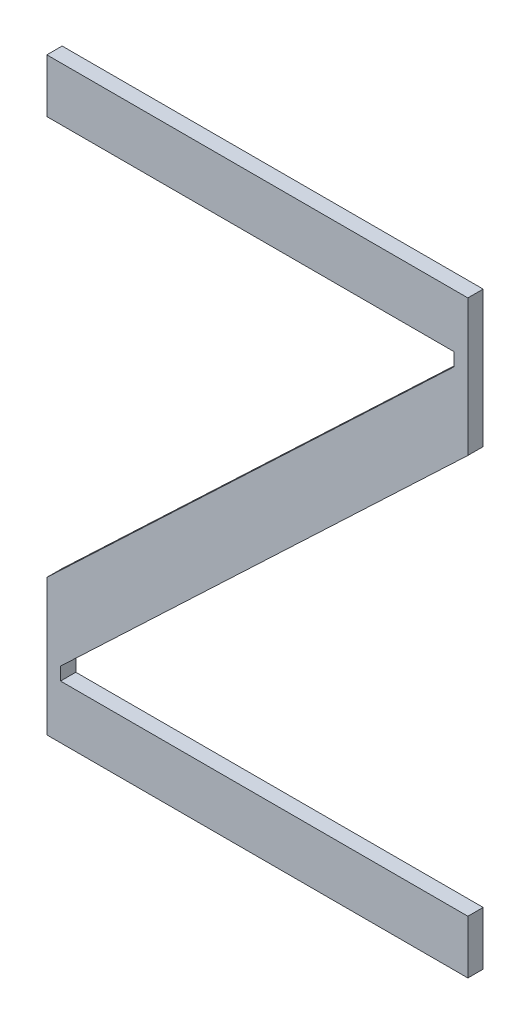
ISO-10303-21;
HEADER;
FILE_DESCRIPTION(('STEP AP214'),'2;1');
FILE_NAME('part.step','',(''),(''),'','','');
FILE_SCHEMA(('AUTOMOTIVE_DESIGN { 1 0 10303 214 1 1 1 1 }'));
ENDSEC;
DATA;
#1=APPLICATION_CONTEXT('core data for automotive mechanical design processes');
#2=APPLICATION_PROTOCOL_DEFINITION('international standard','automotive_design',2000,#1);
#3=PRODUCT_CONTEXT('',#1,'mechanical');
#4=PRODUCT('Part','Part','',(#3));
#5=PRODUCT_RELATED_PRODUCT_CATEGORY('part','',(#4));
#6=PRODUCT_DEFINITION_FORMATION('','',#4);
#7=PRODUCT_DEFINITION_CONTEXT('part definition',#1,'design');
#8=PRODUCT_DEFINITION('design','',#6,#7);
#9=PRODUCT_DEFINITION_SHAPE('','',#8);
#10=(LENGTH_UNIT() NAMED_UNIT(*) SI_UNIT(.MILLI.,.METRE.));
#11=(NAMED_UNIT(*) PLANE_ANGLE_UNIT() SI_UNIT($,.RADIAN.));
#12=(NAMED_UNIT(*) SI_UNIT($,.STERADIAN.) SOLID_ANGLE_UNIT());
#13=UNCERTAINTY_MEASURE_WITH_UNIT(LENGTH_MEASURE(1.E-05),#10,'distance_accuracy_value','');
#14=(GEOMETRIC_REPRESENTATION_CONTEXT(3) GLOBAL_UNCERTAINTY_ASSIGNED_CONTEXT((#13)) GLOBAL_UNIT_ASSIGNED_CONTEXT((#10,
#11,#12)) REPRESENTATION_CONTEXT('',''));
#15=CARTESIAN_POINT('',(0.,0.,0.));
#16=DIRECTION('',(0.,0.,1.));
#17=DIRECTION('',(1.,0.,0.));
#18=AXIS2_PLACEMENT_3D('',#15,#16,#17);
#19=CARTESIAN_POINT('',(0.,0.,20.));
#20=DIRECTION('',(0.,-1.,0.));
#21=DIRECTION('',(1.,0.,0.));
#22=AXIS2_PLACEMENT_3D('',#19,#20,#21);
#23=PLANE('',#22);
#24=DIRECTION('',(-1.,0.,0.));
#25=VECTOR('',#24,1.);
#26=CARTESIAN_POINT('',(0.,0.,0.));
#27=LINE('',#26,#25);
#28=CARTESIAN_POINT('',(0.,0.,0.));
#29=VERTEX_POINT('',#28);
#30=CARTESIAN_POINT('',(-551.,0.,0.));
#31=VERTEX_POINT('',#30);
#32=EDGE_CURVE('E156',#29,#31,#27,.T.);
#33=ORIENTED_EDGE('',*,*,#32,.T.);
#34=DIRECTION('',(0.,0.,-1.));
#35=VECTOR('',#34,1.);
#36=CARTESIAN_POINT('',(-551.,0.,20.));
#37=LINE('',#36,#35);
#38=CARTESIAN_POINT('',(-551.,0.,20.));
#39=VERTEX_POINT('',#38);
#40=EDGE_CURVE('E40',#39,#31,#37,.T.);
#41=ORIENTED_EDGE('',*,*,#40,.F.);
#42=DIRECTION('',(-1.,0.,0.));
#43=VECTOR('',#42,1.);
#44=CARTESIAN_POINT('',(0.,0.,20.));
#45=LINE('',#44,#43);
#46=CARTESIAN_POINT('',(0.,0.,20.));
#47=VERTEX_POINT('',#46);
#48=EDGE_CURVE('E104',#47,#39,#45,.T.);
#49=ORIENTED_EDGE('',*,*,#48,.F.);
#50=DIRECTION('',(0.,0.,-1.));
#51=VECTOR('',#50,1.);
#52=CARTESIAN_POINT('',(0.,0.,20.));
#53=LINE('',#52,#51);
#54=EDGE_CURVE('E11',#47,#29,#53,.T.);
#55=ORIENTED_EDGE('',*,*,#54,.T.);
#56=EDGE_LOOP('',(#33,#41,#49,#55));
#57=FACE_BOUND('',#56,.T.);
#58=ADVANCED_FACE('F32',(#57),#23,.F.);
#59=CARTESIAN_POINT('',(-551.,0.,20.));
#60=DIRECTION('',(1.,0.,0.));
#61=DIRECTION('',(0.,0.,-1.));
#62=AXIS2_PLACEMENT_3D('',#59,#60,#61);
#63=PLANE('',#62);
#64=DIRECTION('',(0.,-1.,0.));
#65=VECTOR('',#64,1.);
#66=CARTESIAN_POINT('',(-551.,0.,0.));
#67=LINE('',#66,#65);
#68=CARTESIAN_POINT('',(-551.,-70.0000000000001,0.));
#69=VERTEX_POINT('',#68);
#70=EDGE_CURVE('E158',#31,#69,#67,.T.);
#71=ORIENTED_EDGE('',*,*,#70,.T.);
#72=DIRECTION('',(0.,0.,-1.));
#73=VECTOR('',#72,1.);
#74=CARTESIAN_POINT('',(-551.,-70.0000000000001,20.));
#75=LINE('',#74,#73);
#76=CARTESIAN_POINT('',(-551.,-70.0000000000001,20.));
#77=VERTEX_POINT('',#76);
#78=EDGE_CURVE('E196',#77,#69,#75,.T.);
#79=ORIENTED_EDGE('',*,*,#78,.F.);
#80=DIRECTION('',(0.,-1.,0.));
#81=VECTOR('',#80,1.);
#82=CARTESIAN_POINT('',(-551.,0.,20.));
#83=LINE('',#82,#81);
#84=EDGE_CURVE('E204',#39,#77,#83,.T.);
#85=ORIENTED_EDGE('',*,*,#84,.F.);
#86=ORIENTED_EDGE('',*,*,#40,.T.);
#87=EDGE_LOOP('',(#71,#79,#85,#86));
#88=FACE_BOUND('',#87,.T.);
#89=ADVANCED_FACE('F202',(#88),#63,.F.);
#90=CARTESIAN_POINT('',(-18.2882568755574,-70.,20.));
#91=DIRECTION('',(0.,1.,0.));
#92=DIRECTION('',(-1.,0.,0.));
#93=AXIS2_PLACEMENT_3D('',#90,#91,#92);
#94=PLANE('',#93);
#95=DIRECTION('',(1.,0.,0.));
#96=VECTOR('',#95,1.);
#97=CARTESIAN_POINT('',(-18.2882568755574,-70.,0.));
#98=LINE('',#97,#96);
#99=CARTESIAN_POINT('',(-18.2882568755574,-70.,0.));
#100=VERTEX_POINT('',#99);
#101=EDGE_CURVE('E160',#69,#100,#98,.T.);
#102=ORIENTED_EDGE('',*,*,#101,.T.);
#103=DIRECTION('',(0.,0.,-1.));
#104=VECTOR('',#103,1.);
#105=CARTESIAN_POINT('',(-18.2882568755574,-70.,20.));
#106=LINE('',#105,#104);
#107=CARTESIAN_POINT('',(-18.2882568755574,-70.,20.));
#108=VERTEX_POINT('',#107);
#109=EDGE_CURVE('E193',#108,#100,#106,.T.);
#110=ORIENTED_EDGE('',*,*,#109,.F.);
#111=DIRECTION('',(1.,0.,0.));
#112=VECTOR('',#111,1.);
#113=CARTESIAN_POINT('',(-18.2882568755574,-70.,20.));
#114=LINE('',#113,#112);
#115=EDGE_CURVE('E223',#77,#108,#114,.T.);
#116=ORIENTED_EDGE('',*,*,#115,.F.);
#117=ORIENTED_EDGE('',*,*,#78,.T.);
#118=EDGE_LOOP('',(#102,#110,#116,#117));
#119=FACE_BOUND('',#118,.T.);
#120=ADVANCED_FACE('F214',(#119),#94,.F.);
#121=CARTESIAN_POINT('',(-18.2882568755574,-70.,20.));
#122=DIRECTION('',(1.,0.,0.));
#123=DIRECTION('',(0.,1.,0.));
#124=AXIS2_PLACEMENT_3D('',#121,#122,#123);
#125=PLANE('',#124);
#126=DIRECTION('',(0.,-1.,0.));
#127=VECTOR('',#126,1.);
#128=CARTESIAN_POINT('',(-18.2882568755574,-70.,0.));
#129=LINE('',#128,#127);
#130=CARTESIAN_POINT('',(-18.2882568755573,-87.3325290711585,0.));
#131=VERTEX_POINT('',#130);
#132=EDGE_CURVE('E162',#100,#131,#129,.T.);
#133=ORIENTED_EDGE('',*,*,#132,.T.);
#134=DIRECTION('',(0.,0.,-1.));
#135=VECTOR('',#134,1.);
#136=CARTESIAN_POINT('',(-18.2882568755573,-87.3325290711585,20.));
#137=LINE('',#136,#135);
#138=CARTESIAN_POINT('',(-18.2882568755573,-87.3325290711585,20.));
#139=VERTEX_POINT('',#138);
#140=EDGE_CURVE('E190',#139,#131,#137,.T.);
#141=ORIENTED_EDGE('',*,*,#140,.F.);
#142=DIRECTION('',(0.,-1.,0.));
#143=VECTOR('',#142,1.);
#144=CARTESIAN_POINT('',(-18.2882568755574,-70.,20.));
#145=LINE('',#144,#143);
#146=EDGE_CURVE('E220',#108,#139,#145,.T.);
#147=ORIENTED_EDGE('',*,*,#146,.F.);
#148=ORIENTED_EDGE('',*,*,#109,.T.);
#149=EDGE_LOOP('',(#133,#141,#147,#148));
#150=FACE_BOUND('',#149,.T.);
#151=ADVANCED_FACE('F218',(#150),#125,.F.);
#152=CARTESIAN_POINT('',(-18.2882568755573,-87.3325290711585,20.));
#153=DIRECTION('',(0.687887112888709,-0.725817690554341,0.));
#154=DIRECTION('',(0.725817690554341,0.687887112888709,0.));
#155=AXIS2_PLACEMENT_3D('',#152,#153,#154);
#156=PLANE('',#155);
#157=DIRECTION('',(-0.725817690554341,-0.687887112888709,0.));
#158=VECTOR('',#157,1.);
#159=CARTESIAN_POINT('',(-18.2882568755573,-87.3325290711585,0.));
#160=LINE('',#159,#158);
#161=CARTESIAN_POINT('',(-551.,-592.205237119804,0.));
#162=VERTEX_POINT('',#161);
#163=EDGE_CURVE('E164',#131,#162,#160,.T.);
#164=ORIENTED_EDGE('',*,*,#163,.T.);
#165=DIRECTION('',(0.,0.,-1.));
#166=VECTOR('',#165,1.);
#167=CARTESIAN_POINT('',(-551.,-592.205237119804,20.));
#168=LINE('',#167,#166);
#169=CARTESIAN_POINT('',(-551.,-592.205237119804,20.));
#170=VERTEX_POINT('',#169);
#171=EDGE_CURVE('E187',#170,#162,#168,.T.);
#172=ORIENTED_EDGE('',*,*,#171,.F.);
#173=DIRECTION('',(-0.725817690554341,-0.687887112888709,0.));
#174=VECTOR('',#173,1.);
#175=CARTESIAN_POINT('',(-18.2882568755573,-87.3325290711585,20.));
#176=LINE('',#175,#174);
#177=EDGE_CURVE('E222',#139,#170,#176,.T.);
#178=ORIENTED_EDGE('',*,*,#177,.F.);
#179=ORIENTED_EDGE('',*,*,#140,.T.);
#180=EDGE_LOOP('',(#164,#172,#178,#179));
#181=FACE_BOUND('',#180,.T.);
#182=ADVANCED_FACE('F265',(#181),#156,.F.);
#183=CARTESIAN_POINT('',(-551.,-700.8,20.));
#184=DIRECTION('',(1.,0.,0.));
#185=DIRECTION('',(0.,0.,-1.));
#186=AXIS2_PLACEMENT_3D('',#183,#184,#185);
#187=PLANE('',#186);
#188=DIRECTION('',(0.,-1.,0.));
#189=VECTOR('',#188,1.);
#190=CARTESIAN_POINT('',(-551.,-700.8,0.));
#191=LINE('',#190,#189);
#192=CARTESIAN_POINT('',(-551.,-770.8,0.));
#193=VERTEX_POINT('',#192);
#194=EDGE_CURVE('E167',#162,#193,#191,.T.);
#195=ORIENTED_EDGE('',*,*,#194,.T.);
#196=DIRECTION('',(0.,0.,-1.));
#197=VECTOR('',#196,1.);
#198=CARTESIAN_POINT('',(-551.,-770.8,20.));
#199=LINE('',#198,#197);
#200=CARTESIAN_POINT('',(-551.,-770.8,20.));
#201=VERTEX_POINT('',#200);
#202=EDGE_CURVE('E184',#201,#193,#199,.T.);
#203=ORIENTED_EDGE('',*,*,#202,.F.);
#204=DIRECTION('',(0.,-1.,0.));
#205=VECTOR('',#204,1.);
#206=CARTESIAN_POINT('',(-551.,-592.205237119804,20.));
#207=LINE('',#206,#205);
#208=EDGE_CURVE('E225',#170,#201,#207,.T.);
#209=ORIENTED_EDGE('',*,*,#208,.F.);
#210=ORIENTED_EDGE('',*,*,#171,.T.);
#211=EDGE_LOOP('',(#195,#203,#209,#210));
#212=FACE_BOUND('',#211,.T.);
#213=ADVANCED_FACE('F268',(#212),#187,.F.);
#214=CARTESIAN_POINT('',(-551.,-770.8,20.));
#215=DIRECTION('',(0.,1.,0.));
#216=DIRECTION('',(0.,0.,1.));
#217=AXIS2_PLACEMENT_3D('',#214,#215,#216);
#218=PLANE('',#217);
#219=DIRECTION('',(1.,0.,0.));
#220=VECTOR('',#219,1.);
#221=CARTESIAN_POINT('',(-551.,-770.8,0.));
#222=LINE('',#221,#220);
#223=CARTESIAN_POINT('',(1.11022302462516E-13,-770.8,0.));
#224=VERTEX_POINT('',#223);
#225=EDGE_CURVE('E169',#193,#224,#222,.T.);
#226=ORIENTED_EDGE('',*,*,#225,.T.);
#227=DIRECTION('',(0.,0.,-1.));
#228=VECTOR('',#227,1.);
#229=CARTESIAN_POINT('',(1.11022302462516E-13,-770.8,20.));
#230=LINE('',#229,#228);
#231=CARTESIAN_POINT('',(1.11022302462516E-13,-770.8,20.));
#232=VERTEX_POINT('',#231);
#233=EDGE_CURVE('E181',#232,#224,#230,.T.);
#234=ORIENTED_EDGE('',*,*,#233,.F.);
#235=DIRECTION('',(1.,0.,0.));
#236=VECTOR('',#235,1.);
#237=CARTESIAN_POINT('',(-551.,-770.8,20.));
#238=LINE('',#237,#236);
#239=EDGE_CURVE('E231',#201,#232,#238,.T.);
#240=ORIENTED_EDGE('',*,*,#239,.F.);
#241=ORIENTED_EDGE('',*,*,#202,.T.);
#242=EDGE_LOOP('',(#226,#234,#240,#241));
#243=FACE_BOUND('',#242,.T.);
#244=ADVANCED_FACE('F237',(#243),#218,.F.);
#245=CARTESIAN_POINT('',(1.11022302462516E-13,-700.8,20.));
#246=DIRECTION('',(-1.,0.,0.));
#247=DIRECTION('',(0.,0.,1.));
#248=AXIS2_PLACEMENT_3D('',#245,#246,#247);
#249=PLANE('',#248);
#250=DIRECTION('',(0.,1.,0.));
#251=VECTOR('',#250,1.);
#252=CARTESIAN_POINT('',(1.11022302462516E-13,-700.8,0.));
#253=LINE('',#252,#251);
#254=CARTESIAN_POINT('',(1.11022302462516E-13,-700.8,0.));
#255=VERTEX_POINT('',#254);
#256=EDGE_CURVE('E171',#224,#255,#253,.T.);
#257=ORIENTED_EDGE('',*,*,#256,.T.);
#258=DIRECTION('',(0.,0.,-1.));
#259=VECTOR('',#258,1.);
#260=CARTESIAN_POINT('',(1.11022302462516E-13,-700.8,20.));
#261=LINE('',#260,#259);
#262=CARTESIAN_POINT('',(1.11022302462516E-13,-700.8,20.));
#263=VERTEX_POINT('',#262);
#264=EDGE_CURVE('E145',#263,#255,#261,.T.);
#265=ORIENTED_EDGE('',*,*,#264,.F.);
#266=DIRECTION('',(0.,1.,0.));
#267=VECTOR('',#266,1.);
#268=CARTESIAN_POINT('',(1.11022302462516E-13,-700.8,20.));
#269=LINE('',#268,#267);
#270=EDGE_CURVE('E136',#232,#263,#269,.T.);
#271=ORIENTED_EDGE('',*,*,#270,.F.);
#272=ORIENTED_EDGE('',*,*,#233,.T.);
#273=EDGE_LOOP('',(#257,#265,#271,#272));
#274=FACE_BOUND('',#273,.T.);
#275=ADVANCED_FACE('F241',(#274),#249,.F.);
#276=CARTESIAN_POINT('',(-533.095953507448,-700.8,20.));
#277=DIRECTION('',(0.,-1.,0.));
#278=DIRECTION('',(0.,0.,-1.));
#279=AXIS2_PLACEMENT_3D('',#276,#277,#278);
#280=PLANE('',#279);
#281=DIRECTION('',(-1.,0.,0.));
#282=VECTOR('',#281,1.);
#283=CARTESIAN_POINT('',(-533.095953507448,-700.8,0.));
#284=LINE('',#283,#282);
#285=CARTESIAN_POINT('',(-533.095953507448,-700.8,0.));
#286=VERTEX_POINT('',#285);
#287=EDGE_CURVE('E144',#255,#286,#284,.T.);
#288=ORIENTED_EDGE('',*,*,#287,.T.);
#289=DIRECTION('',(0.,0.,-1.));
#290=VECTOR('',#289,1.);
#291=CARTESIAN_POINT('',(-533.095953507448,-700.8,20.));
#292=LINE('',#291,#290);
#293=CARTESIAN_POINT('',(-533.095953507448,-700.8,20.));
#294=VERTEX_POINT('',#293);
#295=EDGE_CURVE('E141',#294,#286,#292,.T.);
#296=ORIENTED_EDGE('',*,*,#295,.F.);
#297=DIRECTION('',(-1.,0.,0.));
#298=VECTOR('',#297,1.);
#299=CARTESIAN_POINT('',(-533.095953507448,-700.8,20.));
#300=LINE('',#299,#298);
#301=EDGE_CURVE('E130',#263,#294,#300,.T.);
#302=ORIENTED_EDGE('',*,*,#301,.F.);
#303=ORIENTED_EDGE('',*,*,#264,.T.);
#304=EDGE_LOOP('',(#288,#296,#302,#303));
#305=FACE_BOUND('',#304,.T.);
#306=ADVANCED_FACE('F142',(#305),#280,.F.);
#307=CARTESIAN_POINT('',(-533.095953507448,-683.831602823871,20.));
#308=DIRECTION('',(-1.,0.,0.));
#309=DIRECTION('',(0.,0.,1.));
#310=AXIS2_PLACEMENT_3D('',#307,#308,#309);
#311=PLANE('',#310);
#312=DIRECTION('',(0.,1.,0.));
#313=VECTOR('',#312,1.);
#314=CARTESIAN_POINT('',(-533.095953507448,-683.831602823871,0.));
#315=LINE('',#314,#313);
#316=CARTESIAN_POINT('',(-533.095953507448,-683.831602823871,0.));
#317=VERTEX_POINT('',#316);
#318=EDGE_CURVE('E90',#286,#317,#315,.T.);
#319=ORIENTED_EDGE('',*,*,#318,.T.);
#320=DIRECTION('',(0.,0.,-1.));
#321=VECTOR('',#320,1.);
#322=CARTESIAN_POINT('',(-533.095953507448,-683.831602823871,20.));
#323=LINE('',#322,#321);
#324=CARTESIAN_POINT('',(-533.095953507448,-683.831602823871,20.));
#325=VERTEX_POINT('',#324);
#326=EDGE_CURVE('E146',#325,#317,#323,.T.);
#327=ORIENTED_EDGE('',*,*,#326,.F.);
#328=DIRECTION('',(0.,1.,0.));
#329=VECTOR('',#328,1.);
#330=CARTESIAN_POINT('',(-533.095953507448,-683.831602823871,20.));
#331=LINE('',#330,#329);
#332=EDGE_CURVE('E134',#294,#325,#331,.T.);
#333=ORIENTED_EDGE('',*,*,#332,.F.);
#334=ORIENTED_EDGE('',*,*,#295,.T.);
#335=EDGE_LOOP('',(#319,#327,#333,#334));
#336=FACE_BOUND('',#335,.T.);
#337=ADVANCED_FACE('F148',(#336),#311,.F.);
#338=CARTESIAN_POINT('',(0.,-178.594762880196,20.));
#339=DIRECTION('',(-0.687887112888709,0.725817690554341,0.));
#340=DIRECTION('',(-0.725817690554341,-0.687887112888709,0.));
#341=AXIS2_PLACEMENT_3D('',#338,#339,#340);
#342=PLANE('',#341);
#343=DIRECTION('',(0.725817690554341,0.687887112888709,0.));
#344=VECTOR('',#343,1.);
#345=CARTESIAN_POINT('',(0.,-178.594762880196,0.));
#346=LINE('',#345,#344);
#347=CARTESIAN_POINT('',(0.,-178.594762880196,0.));
#348=VERTEX_POINT('',#347);
#349=EDGE_CURVE('E97',#317,#348,#346,.T.);
#350=ORIENTED_EDGE('',*,*,#349,.T.);
#351=DIRECTION('',(0.,0.,-1.));
#352=VECTOR('',#351,1.);
#353=CARTESIAN_POINT('',(0.,-178.594762880196,20.));
#354=LINE('',#353,#352);
#355=CARTESIAN_POINT('',(0.,-178.594762880196,20.));
#356=VERTEX_POINT('',#355);
#357=EDGE_CURVE('E152',#356,#348,#354,.T.);
#358=ORIENTED_EDGE('',*,*,#357,.F.);
#359=DIRECTION('',(0.725817690554341,0.687887112888709,0.));
#360=VECTOR('',#359,1.);
#361=CARTESIAN_POINT('',(0.,-178.594762880196,20.));
#362=LINE('',#361,#360);
#363=EDGE_CURVE('E150',#325,#356,#362,.T.);
#364=ORIENTED_EDGE('',*,*,#363,.F.);
#365=ORIENTED_EDGE('',*,*,#326,.T.);
#366=EDGE_LOOP('',(#350,#358,#364,#365));
#367=FACE_BOUND('',#366,.T.);
#368=ADVANCED_FACE('F243',(#367),#342,.F.);
#369=CARTESIAN_POINT('',(0.,-70.,20.));
#370=DIRECTION('',(-1.,0.,0.));
#371=DIRECTION('',(0.,-1.,0.));
#372=AXIS2_PLACEMENT_3D('',#369,#370,#371);
#373=PLANE('',#372);
#374=DIRECTION('',(0.,1.,0.));
#375=VECTOR('',#374,1.);
#376=CARTESIAN_POINT('',(0.,-70.,0.));
#377=LINE('',#376,#375);
#378=EDGE_CURVE('E176',#348,#29,#377,.T.);
#379=ORIENTED_EDGE('',*,*,#378,.T.);
#380=ORIENTED_EDGE('',*,*,#54,.F.);
#381=DIRECTION('',(0.,1.,0.));
#382=VECTOR('',#381,1.);
#383=CARTESIAN_POINT('',(0.,0.,20.));
#384=LINE('',#383,#382);
#385=EDGE_CURVE('E48',#356,#47,#384,.T.);
#386=ORIENTED_EDGE('',*,*,#385,.F.);
#387=ORIENTED_EDGE('',*,*,#357,.T.);
#388=EDGE_LOOP('',(#379,#380,#386,#387));
#389=FACE_BOUND('',#388,.T.);
#390=ADVANCED_FACE('F242',(#389),#373,.F.);
#391=CARTESIAN_POINT('',(0.,0.,20.));
#392=DIRECTION('',(0.,0.,1.));
#393=DIRECTION('',(1.,0.,0.));
#394=AXIS2_PLACEMENT_3D('',#391,#392,#393);
#395=PLANE('',#394);
#396=ORIENTED_EDGE('',*,*,#385,.T.);
#397=ORIENTED_EDGE('',*,*,#48,.T.);
#398=ORIENTED_EDGE('',*,*,#84,.T.);
#399=ORIENTED_EDGE('',*,*,#115,.T.);
#400=ORIENTED_EDGE('',*,*,#146,.T.);
#401=ORIENTED_EDGE('',*,*,#177,.T.);
#402=ORIENTED_EDGE('',*,*,#208,.T.);
#403=ORIENTED_EDGE('',*,*,#239,.T.);
#404=ORIENTED_EDGE('',*,*,#270,.T.);
#405=ORIENTED_EDGE('',*,*,#301,.T.);
#406=ORIENTED_EDGE('',*,*,#332,.T.);
#407=ORIENTED_EDGE('',*,*,#363,.T.);
#408=EDGE_LOOP('',(#396,#397,#398,#399,#400,#401,#402,#403,#404,#405,#406,#407));
#409=FACE_BOUND('',#408,.T.);
#410=ADVANCED_FACE('F132',(#409),#395,.T.);
#411=CARTESIAN_POINT('',(0.,0.,0.));
#412=DIRECTION('',(0.,0.,1.));
#413=DIRECTION('',(1.,0.,0.));
#414=AXIS2_PLACEMENT_3D('',#411,#412,#413);
#415=PLANE('',#414);
#416=ORIENTED_EDGE('',*,*,#32,.F.);
#417=ORIENTED_EDGE('',*,*,#378,.F.);
#418=ORIENTED_EDGE('',*,*,#349,.F.);
#419=ORIENTED_EDGE('',*,*,#318,.F.);
#420=ORIENTED_EDGE('',*,*,#287,.F.);
#421=ORIENTED_EDGE('',*,*,#256,.F.);
#422=ORIENTED_EDGE('',*,*,#225,.F.);
#423=ORIENTED_EDGE('',*,*,#194,.F.);
#424=ORIENTED_EDGE('',*,*,#163,.F.);
#425=ORIENTED_EDGE('',*,*,#132,.F.);
#426=ORIENTED_EDGE('',*,*,#101,.F.);
#427=ORIENTED_EDGE('',*,*,#70,.F.);
#428=EDGE_LOOP('',(#416,#417,#418,#419,#420,#421,#422,#423,#424,#425,#426,#427));
#429=FACE_BOUND('',#428,.T.);
#430=ADVANCED_FACE('F208',(#429),#415,.F.);
#431=CLOSED_SHELL('',(#58,#89,#120,#151,#182,#213,#244,#275,#306,#337,#368,#390,#410,#430));
#432=MANIFOLD_SOLID_BREP('B2',#431);
#433=ADVANCED_BREP_SHAPE_REPRESENTATION('',(#18,#432),#14);
#434=SHAPE_DEFINITION_REPRESENTATION(#9,#433);
ENDSEC;
END-ISO-10303-21;
